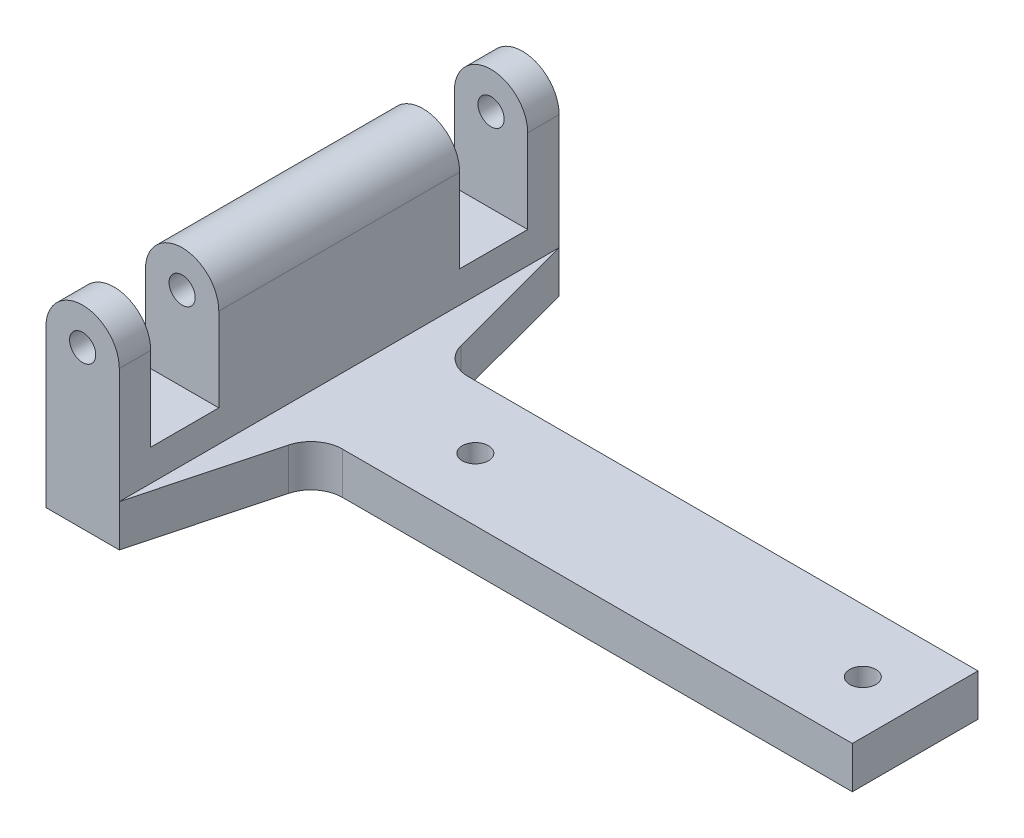
ISO-10303-21;
HEADER;
FILE_DESCRIPTION(('STEP AP214'),'2;1');
FILE_NAME('part.step','',(''),(''),'','','');
FILE_SCHEMA(('AUTOMOTIVE_DESIGN { 1 0 10303 214 1 1 1 1 }'));
ENDSEC;
DATA;
#1=APPLICATION_CONTEXT('core data for automotive mechanical design processes');
#2=APPLICATION_PROTOCOL_DEFINITION('international standard','automotive_design',2000,#1);
#3=PRODUCT_CONTEXT('',#1,'mechanical');
#4=PRODUCT('Part','Part','',(#3));
#5=PRODUCT_RELATED_PRODUCT_CATEGORY('part','',(#4));
#6=PRODUCT_DEFINITION_FORMATION('','',#4);
#7=PRODUCT_DEFINITION_CONTEXT('part definition',#1,'design');
#8=PRODUCT_DEFINITION('design','',#6,#7);
#9=PRODUCT_DEFINITION_SHAPE('','',#8);
#10=(LENGTH_UNIT() NAMED_UNIT(*) SI_UNIT(.MILLI.,.METRE.));
#11=(NAMED_UNIT(*) PLANE_ANGLE_UNIT() SI_UNIT($,.RADIAN.));
#12=(NAMED_UNIT(*) SI_UNIT($,.STERADIAN.) SOLID_ANGLE_UNIT());
#13=UNCERTAINTY_MEASURE_WITH_UNIT(LENGTH_MEASURE(1.E-05),#10,'distance_accuracy_value','');
#14=(GEOMETRIC_REPRESENTATION_CONTEXT(3) GLOBAL_UNCERTAINTY_ASSIGNED_CONTEXT((#13)) GLOBAL_UNIT_ASSIGNED_CONTEXT((#10,
#11,#12)) REPRESENTATION_CONTEXT('',''));
#15=CARTESIAN_POINT('',(0.,0.,0.));
#16=DIRECTION('',(0.,0.,1.));
#17=DIRECTION('',(1.,0.,0.));
#18=AXIS2_PLACEMENT_3D('',#15,#16,#17);
#19=CARTESIAN_POINT('',(-31.,15.,21.));
#20=DIRECTION('',(0.,0.,1.));
#21=DIRECTION('',(1.,0.,0.));
#22=AXIS2_PLACEMENT_3D('',#19,#20,#21);
#23=CYLINDRICAL_SURFACE('',#22,1.24999999999999);
#24=CARTESIAN_POINT('',(-31.,15.,-11.5));
#25=DIRECTION('',(0.,0.,1.));
#26=DIRECTION('',(1.,0.,0.));
#27=AXIS2_PLACEMENT_3D('',#24,#25,#26);
#28=CIRCLE('',#27,1.24999999999999);
#29=CARTESIAN_POINT('',(-29.75,15.,-11.5));
#30=VERTEX_POINT('',#29);
#31=EDGE_CURVE('E246',#30,#30,#28,.F.);
#32=ORIENTED_EDGE('',*,*,#31,.T.);
#33=EDGE_LOOP('',(#32));
#34=FACE_BOUND('',#33,.T.);
#35=CARTESIAN_POINT('',(-31.,15.,11.5));
#36=DIRECTION('',(0.,0.,1.));
#37=DIRECTION('',(1.,0.,0.));
#38=AXIS2_PLACEMENT_3D('',#35,#36,#37);
#39=CIRCLE('',#38,1.24999999999999);
#40=CARTESIAN_POINT('',(-29.75,15.,11.5));
#41=VERTEX_POINT('',#40);
#42=EDGE_CURVE('E144',#41,#41,#39,.T.);
#43=ORIENTED_EDGE('',*,*,#42,.T.);
#44=EDGE_LOOP('',(#43));
#45=FACE_BOUND('',#44,.T.);
#46=ADVANCED_FACE('F17',(#34,#45),#23,.F.);
#47=CARTESIAN_POINT('',(-31.,15.,21.));
#48=DIRECTION('',(0.,0.,1.));
#49=DIRECTION('',(1.,0.,0.));
#50=AXIS2_PLACEMENT_3D('',#47,#48,#49);
#51=CYLINDRICAL_SURFACE('',#50,1.24999999999999);
#52=CARTESIAN_POINT('',(-31.,15.,-21.));
#53=DIRECTION('',(0.,0.,1.));
#54=DIRECTION('',(1.,0.,0.));
#55=AXIS2_PLACEMENT_3D('',#52,#53,#54);
#56=CIRCLE('',#55,1.24999999999999);
#57=CARTESIAN_POINT('',(-29.75,15.,-21.));
#58=VERTEX_POINT('',#57);
#59=EDGE_CURVE('E222',#58,#58,#56,.F.);
#60=ORIENTED_EDGE('',*,*,#59,.T.);
#61=EDGE_LOOP('',(#60));
#62=FACE_BOUND('',#61,.T.);
#63=CARTESIAN_POINT('',(-31.,15.,-18.));
#64=DIRECTION('',(0.,0.,1.));
#65=DIRECTION('',(1.,0.,0.));
#66=AXIS2_PLACEMENT_3D('',#63,#64,#65);
#67=CIRCLE('',#66,1.24999999999999);
#68=CARTESIAN_POINT('',(-29.75,15.,-18.));
#69=VERTEX_POINT('',#68);
#70=EDGE_CURVE('E20',#69,#69,#67,.T.);
#71=ORIENTED_EDGE('',*,*,#70,.T.);
#72=EDGE_LOOP('',(#71));
#73=FACE_BOUND('',#72,.T.);
#74=ADVANCED_FACE('F261',(#62,#73),#51,.F.);
#75=CARTESIAN_POINT('',(-34.5,30.5709247622408,-18.));
#76=DIRECTION('',(0.,0.,-1.));
#77=DIRECTION('',(0.,1.,0.));
#78=AXIS2_PLACEMENT_3D('',#75,#76,#77);
#79=PLANE('',#78);
#80=DIRECTION('',(0.,1.,0.));
#81=VECTOR('',#80,1.);
#82=CARTESIAN_POINT('',(-34.5,0.,-18.));
#83=LINE('',#82,#81);
#84=CARTESIAN_POINT('',(-34.5,6.99999999999999,-18.));
#85=VERTEX_POINT('',#84);
#86=CARTESIAN_POINT('',(-34.5,15.,-18.));
#87=VERTEX_POINT('',#86);
#88=EDGE_CURVE('E107',#85,#87,#83,.T.);
#89=ORIENTED_EDGE('',*,*,#88,.F.);
#90=DIRECTION('',(1.,0.,0.));
#91=VECTOR('',#90,1.);
#92=CARTESIAN_POINT('',(-34.5,6.99999999999999,-18.));
#93=LINE('',#92,#91);
#94=CARTESIAN_POINT('',(-27.5,6.99999999999999,-18.));
#95=VERTEX_POINT('',#94);
#96=EDGE_CURVE('E115',#85,#95,#93,.T.);
#97=ORIENTED_EDGE('',*,*,#96,.T.);
#98=DIRECTION('',(0.,1.,0.));
#99=VECTOR('',#98,1.);
#100=CARTESIAN_POINT('',(-27.5,0.,-18.));
#101=LINE('',#100,#99);
#102=CARTESIAN_POINT('',(-27.5,15.,-18.));
#103=VERTEX_POINT('',#102);
#104=EDGE_CURVE('E186',#103,#95,#101,.F.);
#105=ORIENTED_EDGE('',*,*,#104,.F.);
#106=CARTESIAN_POINT('',(-31.,15.,-18.));
#107=DIRECTION('',(0.,0.,1.));
#108=DIRECTION('',(1.,0.,0.));
#109=AXIS2_PLACEMENT_3D('',#106,#107,#108);
#110=CIRCLE('',#109,3.5);
#111=EDGE_CURVE('E145',#87,#103,#110,.F.);
#112=ORIENTED_EDGE('',*,*,#111,.F.);
#113=EDGE_LOOP('',(#89,#97,#105,#112));
#114=FACE_BOUND('',#113,.T.);
#115=ORIENTED_EDGE('',*,*,#70,.F.);
#116=EDGE_LOOP('',(#115));
#117=FACE_BOUND('',#116,.T.);
#118=ADVANCED_FACE('F263',(#114,#117),#79,.F.);
#119=CARTESIAN_POINT('',(-31.,15.,-40.7800404448525));
#120=DIRECTION('',(0.,0.,1.));
#121=DIRECTION('',(1.,0.,0.));
#122=AXIS2_PLACEMENT_3D('',#119,#120,#121);
#123=CYLINDRICAL_SURFACE('',#122,3.5);
#124=CARTESIAN_POINT('',(-31.,15.,-21.));
#125=DIRECTION('',(0.,0.,1.));
#126=DIRECTION('',(1.,0.,0.));
#127=AXIS2_PLACEMENT_3D('',#124,#125,#126);
#128=CIRCLE('',#127,3.5);
#129=CARTESIAN_POINT('',(-27.5,15.,-21.));
#130=VERTEX_POINT('',#129);
#131=CARTESIAN_POINT('',(-34.5,15.,-21.));
#132=VERTEX_POINT('',#131);
#133=EDGE_CURVE('E218',#130,#132,#128,.T.);
#134=ORIENTED_EDGE('',*,*,#133,.T.);
#135=DIRECTION('',(0.,0.,1.));
#136=VECTOR('',#135,1.);
#137=CARTESIAN_POINT('',(-34.5,15.,-40.7800404448525));
#138=LINE('',#137,#136);
#139=EDGE_CURVE('E608',#87,#132,#138,.F.);
#140=ORIENTED_EDGE('',*,*,#139,.F.);
#141=ORIENTED_EDGE('',*,*,#111,.T.);
#142=DIRECTION('',(0.,0.,1.));
#143=VECTOR('',#142,1.);
#144=CARTESIAN_POINT('',(-27.5,15.,-40.7800404448525));
#145=LINE('',#144,#143);
#146=EDGE_CURVE('E163',#130,#103,#145,.T.);
#147=ORIENTED_EDGE('',*,*,#146,.F.);
#148=EDGE_LOOP('',(#134,#140,#141,#147));
#149=FACE_BOUND('',#148,.T.);
#150=ADVANCED_FACE('F265',(#149),#123,.T.);
#151=CARTESIAN_POINT('',(-34.5,31.9586405510147,18.));
#152=DIRECTION('',(0.,0.,1.));
#153=DIRECTION('',(0.,-1.,0.));
#154=AXIS2_PLACEMENT_3D('',#151,#152,#153);
#155=PLANE('',#154);
#156=DIRECTION('',(0.,1.,0.));
#157=VECTOR('',#156,1.);
#158=CARTESIAN_POINT('',(-27.5,0.,18.));
#159=LINE('',#158,#157);
#160=CARTESIAN_POINT('',(-27.5,6.99999999999999,18.));
#161=VERTEX_POINT('',#160);
#162=CARTESIAN_POINT('',(-27.5,15.,18.));
#163=VERTEX_POINT('',#162);
#164=EDGE_CURVE('E151',#161,#163,#159,.T.);
#165=ORIENTED_EDGE('',*,*,#164,.F.);
#166=DIRECTION('',(1.,0.,0.));
#167=VECTOR('',#166,1.);
#168=CARTESIAN_POINT('',(-34.5,6.99999999999999,18.));
#169=LINE('',#168,#167);
#170=CARTESIAN_POINT('',(-34.5,6.99999999999999,18.));
#171=VERTEX_POINT('',#170);
#172=EDGE_CURVE('E135',#161,#171,#169,.F.);
#173=ORIENTED_EDGE('',*,*,#172,.T.);
#174=DIRECTION('',(0.,1.,0.));
#175=VECTOR('',#174,1.);
#176=CARTESIAN_POINT('',(-34.5,0.,18.));
#177=LINE('',#176,#175);
#178=CARTESIAN_POINT('',(-34.5,15.,18.));
#179=VERTEX_POINT('',#178);
#180=EDGE_CURVE('E589',#179,#171,#177,.F.);
#181=ORIENTED_EDGE('',*,*,#180,.F.);
#182=CARTESIAN_POINT('',(-31.,15.,18.));
#183=DIRECTION('',(0.,0.,1.));
#184=DIRECTION('',(1.,0.,0.));
#185=AXIS2_PLACEMENT_3D('',#182,#183,#184);
#186=CIRCLE('',#185,3.5);
#187=EDGE_CURVE('E159',#163,#179,#186,.T.);
#188=ORIENTED_EDGE('',*,*,#187,.F.);
#189=EDGE_LOOP('',(#165,#173,#181,#188));
#190=FACE_BOUND('',#189,.T.);
#191=CARTESIAN_POINT('',(-31.,15.,18.));
#192=DIRECTION('',(0.,0.,1.));
#193=DIRECTION('',(1.,0.,0.));
#194=AXIS2_PLACEMENT_3D('',#191,#192,#193);
#195=CIRCLE('',#194,1.24999999999999);
#196=CARTESIAN_POINT('',(-29.75,15.,18.));
#197=VERTEX_POINT('',#196);
#198=EDGE_CURVE('E238',#197,#197,#195,.T.);
#199=ORIENTED_EDGE('',*,*,#198,.T.);
#200=EDGE_LOOP('',(#199));
#201=FACE_BOUND('',#200,.T.);
#202=ADVANCED_FACE('F157',(#190,#201),#155,.F.);
#203=CARTESIAN_POINT('',(-34.5,6.99999999999999,18.));
#204=DIRECTION('',(0.,-1.,0.));
#205=DIRECTION('',(0.,0.,-1.));
#206=AXIS2_PLACEMENT_3D('',#203,#204,#205);
#207=PLANE('',#206);
#208=DIRECTION('',(1.,0.,0.));
#209=VECTOR('',#208,1.);
#210=CARTESIAN_POINT('',(-34.5,6.99999999999999,11.5));
#211=LINE('',#210,#209);
#212=CARTESIAN_POINT('',(-27.5,6.99999999999999,11.5));
#213=VERTEX_POINT('',#212);
#214=CARTESIAN_POINT('',(-34.5,6.99999999999999,11.5));
#215=VERTEX_POINT('',#214);
#216=EDGE_CURVE('E251',#213,#215,#211,.F.);
#217=ORIENTED_EDGE('',*,*,#216,.T.);
#218=DIRECTION('',(0.,0.,1.));
#219=VECTOR('',#218,1.);
#220=CARTESIAN_POINT('',(-34.5,6.99999999999999,-40.7800404448525));
#221=LINE('',#220,#219);
#222=EDGE_CURVE('E140',#171,#215,#221,.F.);
#223=ORIENTED_EDGE('',*,*,#222,.F.);
#224=ORIENTED_EDGE('',*,*,#172,.F.);
#225=DIRECTION('',(0.,0.,1.));
#226=VECTOR('',#225,1.);
#227=CARTESIAN_POINT('',(-27.5,6.99999999999999,-40.7800404448525));
#228=LINE('',#227,#226);
#229=EDGE_CURVE('E139',#213,#161,#228,.T.);
#230=ORIENTED_EDGE('',*,*,#229,.F.);
#231=EDGE_LOOP('',(#217,#223,#224,#230));
#232=FACE_BOUND('',#231,.T.);
#233=ADVANCED_FACE('F138',(#232),#207,.F.);
#234=CARTESIAN_POINT('',(-34.5,31.9586405510147,11.5));
#235=DIRECTION('',(0.,0.,-1.));
#236=DIRECTION('',(0.,1.,0.));
#237=AXIS2_PLACEMENT_3D('',#234,#235,#236);
#238=PLANE('',#237);
#239=DIRECTION('',(0.,1.,0.));
#240=VECTOR('',#239,1.);
#241=CARTESIAN_POINT('',(-34.5,0.,11.5));
#242=LINE('',#241,#240);
#243=CARTESIAN_POINT('',(-34.5,15.,11.5));
#244=VERTEX_POINT('',#243);
#245=EDGE_CURVE('E583',#215,#244,#242,.T.);
#246=ORIENTED_EDGE('',*,*,#245,.F.);
#247=ORIENTED_EDGE('',*,*,#216,.F.);
#248=DIRECTION('',(0.,1.,0.));
#249=VECTOR('',#248,1.);
#250=CARTESIAN_POINT('',(-27.5,0.,11.5));
#251=LINE('',#250,#249);
#252=CARTESIAN_POINT('',(-27.5,15.,11.5));
#253=VERTEX_POINT('',#252);
#254=EDGE_CURVE('E155',#253,#213,#251,.F.);
#255=ORIENTED_EDGE('',*,*,#254,.F.);
#256=CARTESIAN_POINT('',(-31.,15.,11.5));
#257=DIRECTION('',(0.,0.,1.));
#258=DIRECTION('',(1.,0.,0.));
#259=AXIS2_PLACEMENT_3D('',#256,#257,#258);
#260=CIRCLE('',#259,3.5);
#261=EDGE_CURVE('E249',#244,#253,#260,.F.);
#262=ORIENTED_EDGE('',*,*,#261,.F.);
#263=EDGE_LOOP('',(#246,#247,#255,#262));
#264=FACE_BOUND('',#263,.T.);
#265=ORIENTED_EDGE('',*,*,#42,.F.);
#266=EDGE_LOOP('',(#265));
#267=FACE_BOUND('',#266,.T.);
#268=ADVANCED_FACE('F354',(#264,#267),#238,.F.);
#269=CARTESIAN_POINT('',(-31.,15.,-40.7800404448525));
#270=DIRECTION('',(0.,0.,1.));
#271=DIRECTION('',(1.,0.,0.));
#272=AXIS2_PLACEMENT_3D('',#269,#270,#271);
#273=CYLINDRICAL_SURFACE('',#272,3.5);
#274=ORIENTED_EDGE('',*,*,#261,.T.);
#275=DIRECTION('',(0.,0.,1.));
#276=VECTOR('',#275,1.);
#277=CARTESIAN_POINT('',(-27.5,15.,-40.7800404448525));
#278=LINE('',#277,#276);
#279=CARTESIAN_POINT('',(-27.5,15.,-11.5));
#280=VERTEX_POINT('',#279);
#281=EDGE_CURVE('E174',#280,#253,#278,.T.);
#282=ORIENTED_EDGE('',*,*,#281,.F.);
#283=CARTESIAN_POINT('',(-31.,15.,-11.5));
#284=DIRECTION('',(0.,0.,1.));
#285=DIRECTION('',(1.,0.,0.));
#286=AXIS2_PLACEMENT_3D('',#283,#284,#285);
#287=CIRCLE('',#286,3.5);
#288=CARTESIAN_POINT('',(-34.5,15.,-11.5));
#289=VERTEX_POINT('',#288);
#290=EDGE_CURVE('E242',#280,#289,#287,.T.);
#291=ORIENTED_EDGE('',*,*,#290,.T.);
#292=DIRECTION('',(0.,0.,1.));
#293=VECTOR('',#292,1.);
#294=CARTESIAN_POINT('',(-34.5,15.,-40.7800404448525));
#295=LINE('',#294,#293);
#296=EDGE_CURVE('E585',#244,#289,#295,.F.);
#297=ORIENTED_EDGE('',*,*,#296,.F.);
#298=EDGE_LOOP('',(#274,#282,#291,#297));
#299=FACE_BOUND('',#298,.T.);
#300=ADVANCED_FACE('F350',(#299),#273,.T.);
#301=CARTESIAN_POINT('',(-34.5,30.5709247622408,-11.5));
#302=DIRECTION('',(0.,0.,1.));
#303=DIRECTION('',(0.,-1.,0.));
#304=AXIS2_PLACEMENT_3D('',#301,#302,#303);
#305=PLANE('',#304);
#306=DIRECTION('',(0.,1.,0.));
#307=VECTOR('',#306,1.);
#308=CARTESIAN_POINT('',(-27.5,0.,-11.5));
#309=LINE('',#308,#307);
#310=CARTESIAN_POINT('',(-27.5,6.99999999999999,-11.5));
#311=VERTEX_POINT('',#310);
#312=EDGE_CURVE('E178',#311,#280,#309,.T.);
#313=ORIENTED_EDGE('',*,*,#312,.F.);
#314=DIRECTION('',(1.,0.,0.));
#315=VECTOR('',#314,1.);
#316=CARTESIAN_POINT('',(-34.5,6.99999999999999,-11.5));
#317=LINE('',#316,#315);
#318=CARTESIAN_POINT('',(-34.5,6.99999999999999,-11.5));
#319=VERTEX_POINT('',#318);
#320=EDGE_CURVE('E245',#311,#319,#317,.F.);
#321=ORIENTED_EDGE('',*,*,#320,.T.);
#322=DIRECTION('',(0.,1.,0.));
#323=VECTOR('',#322,1.);
#324=CARTESIAN_POINT('',(-34.5,0.,-11.5));
#325=LINE('',#324,#323);
#326=EDGE_CURVE('E587',#289,#319,#325,.F.);
#327=ORIENTED_EDGE('',*,*,#326,.F.);
#328=ORIENTED_EDGE('',*,*,#290,.F.);
#329=EDGE_LOOP('',(#313,#321,#327,#328));
#330=FACE_BOUND('',#329,.T.);
#331=ORIENTED_EDGE('',*,*,#31,.F.);
#332=EDGE_LOOP('',(#331));
#333=FACE_BOUND('',#332,.T.);
#334=ADVANCED_FACE('F347',(#330,#333),#305,.F.);
#335=CARTESIAN_POINT('',(-34.5,6.99999999999999,-11.5));
#336=DIRECTION('',(0.,-1.,0.));
#337=DIRECTION('',(0.,0.,-1.));
#338=AXIS2_PLACEMENT_3D('',#335,#336,#337);
#339=PLANE('',#338);
#340=ORIENTED_EDGE('',*,*,#96,.F.);
#341=DIRECTION('',(0.,0.,1.));
#342=VECTOR('',#341,1.);
#343=CARTESIAN_POINT('',(-34.5,6.99999999999999,-40.7800404448525));
#344=LINE('',#343,#342);
#345=EDGE_CURVE('E631',#319,#85,#344,.F.);
#346=ORIENTED_EDGE('',*,*,#345,.F.);
#347=ORIENTED_EDGE('',*,*,#320,.F.);
#348=DIRECTION('',(0.,0.,1.));
#349=VECTOR('',#348,1.);
#350=CARTESIAN_POINT('',(-27.5,6.99999999999999,-40.7800404448525));
#351=LINE('',#350,#349);
#352=EDGE_CURVE('E181',#95,#311,#351,.T.);
#353=ORIENTED_EDGE('',*,*,#352,.F.);
#354=EDGE_LOOP('',(#340,#346,#347,#353));
#355=FACE_BOUND('',#354,.T.);
#356=ADVANCED_FACE('F343',(#355),#339,.F.);
#357=CARTESIAN_POINT('',(-31.,15.,-40.7800404448525));
#358=DIRECTION('',(0.,0.,1.));
#359=DIRECTION('',(1.,0.,0.));
#360=AXIS2_PLACEMENT_3D('',#357,#358,#359);
#361=CYLINDRICAL_SURFACE('',#360,3.5);
#362=CARTESIAN_POINT('',(-31.,15.,21.));
#363=DIRECTION('',(0.,0.,1.));
#364=DIRECTION('',(1.,0.,0.));
#365=AXIS2_PLACEMENT_3D('',#362,#363,#364);
#366=CIRCLE('',#365,3.5);
#367=CARTESIAN_POINT('',(-34.5,15.,21.));
#368=VERTEX_POINT('',#367);
#369=CARTESIAN_POINT('',(-27.5,15.,21.));
#370=VERTEX_POINT('',#369);
#371=EDGE_CURVE('E214',#368,#370,#366,.F.);
#372=ORIENTED_EDGE('',*,*,#371,.T.);
#373=DIRECTION('',(0.,0.,1.));
#374=VECTOR('',#373,1.);
#375=CARTESIAN_POINT('',(-27.5,15.,-40.7800404448525));
#376=LINE('',#375,#374);
#377=EDGE_CURVE('E161',#163,#370,#376,.T.);
#378=ORIENTED_EDGE('',*,*,#377,.F.);
#379=ORIENTED_EDGE('',*,*,#187,.T.);
#380=DIRECTION('',(0.,0.,1.));
#381=VECTOR('',#380,1.);
#382=CARTESIAN_POINT('',(-34.5,15.,-40.7800404448525));
#383=LINE('',#382,#381);
#384=EDGE_CURVE('E605',#368,#179,#383,.F.);
#385=ORIENTED_EDGE('',*,*,#384,.F.);
#386=EDGE_LOOP('',(#372,#378,#379,#385));
#387=FACE_BOUND('',#386,.T.);
#388=ADVANCED_FACE('F340',(#387),#361,.T.);
#389=CARTESIAN_POINT('',(-27.5,0.,-40.7800404448525));
#390=DIRECTION('',(1.,0.,0.));
#391=DIRECTION('',(0.,1.,0.));
#392=AXIS2_PLACEMENT_3D('',#389,#390,#391);
#393=PLANE('',#392);
#394=DIRECTION('',(0.,1.,0.));
#395=VECTOR('',#394,1.);
#396=CARTESIAN_POINT('',(-27.5,4.,-21.));
#397=LINE('',#396,#395);
#398=CARTESIAN_POINT('',(-27.5,4.,-21.));
#399=VERTEX_POINT('',#398);
#400=EDGE_CURVE('E612',#399,#130,#397,.T.);
#401=ORIENTED_EDGE('',*,*,#400,.T.);
#402=ORIENTED_EDGE('',*,*,#146,.T.);
#403=ORIENTED_EDGE('',*,*,#104,.T.);
#404=ORIENTED_EDGE('',*,*,#352,.T.);
#405=ORIENTED_EDGE('',*,*,#312,.T.);
#406=ORIENTED_EDGE('',*,*,#281,.T.);
#407=ORIENTED_EDGE('',*,*,#254,.T.);
#408=ORIENTED_EDGE('',*,*,#229,.T.);
#409=ORIENTED_EDGE('',*,*,#164,.T.);
#410=ORIENTED_EDGE('',*,*,#377,.T.);
#411=DIRECTION('',(0.,1.,0.));
#412=VECTOR('',#411,1.);
#413=CARTESIAN_POINT('',(-27.5,4.,21.));
#414=LINE('',#413,#412);
#415=CARTESIAN_POINT('',(-27.5,4.,21.));
#416=VERTEX_POINT('',#415);
#417=EDGE_CURVE('E213',#370,#416,#414,.F.);
#418=ORIENTED_EDGE('',*,*,#417,.T.);
#419=DIRECTION('',(0.,0.,1.));
#420=VECTOR('',#419,1.);
#421=CARTESIAN_POINT('',(-27.5,4.,0.));
#422=LINE('',#421,#420);
#423=EDGE_CURVE('E237',#399,#416,#422,.T.);
#424=ORIENTED_EDGE('',*,*,#423,.F.);
#425=EDGE_LOOP('',(#401,#402,#403,#404,#405,#406,#407,#408,#409,#410,#418,#424));
#426=FACE_BOUND('',#425,.T.);
#427=ADVANCED_FACE('F150',(#426),#393,.T.);
#428=CARTESIAN_POINT('',(-31.,15.,21.));
#429=DIRECTION('',(0.,0.,1.));
#430=DIRECTION('',(1.,0.,0.));
#431=AXIS2_PLACEMENT_3D('',#428,#429,#430);
#432=CYLINDRICAL_SURFACE('',#431,1.24999999999999);
#433=ORIENTED_EDGE('',*,*,#198,.F.);
#434=EDGE_LOOP('',(#433));
#435=FACE_BOUND('',#434,.T.);
#436=CARTESIAN_POINT('',(-31.,15.,21.));
#437=DIRECTION('',(0.,0.,1.));
#438=DIRECTION('',(1.,0.,0.));
#439=AXIS2_PLACEMENT_3D('',#436,#437,#438);
#440=CIRCLE('',#439,1.24999999999999);
#441=CARTESIAN_POINT('',(-29.75,15.,21.));
#442=VERTEX_POINT('',#441);
#443=EDGE_CURVE('E209',#442,#442,#440,.T.);
#444=ORIENTED_EDGE('',*,*,#443,.T.);
#445=EDGE_LOOP('',(#444));
#446=FACE_BOUND('',#445,.T.);
#447=ADVANCED_FACE('F333',(#435,#446),#432,.F.);
#448=CARTESIAN_POINT('',(0.,4.,0.));
#449=DIRECTION('',(0.,1.,0.));
#450=DIRECTION('',(0.,0.,1.));
#451=AXIS2_PLACEMENT_3D('',#448,#449,#450);
#452=PLANE('',#451);
#453=CARTESIAN_POINT('',(22.5,4.,0.));
#454=DIRECTION('',(0.,1.,0.));
#455=DIRECTION('',(0.,0.,1.));
#456=AXIS2_PLACEMENT_3D('',#453,#454,#455);
#457=CIRCLE('',#456,1.24999999999999);
#458=CARTESIAN_POINT('',(22.5,4.,1.24999999999999));
#459=VERTEX_POINT('',#458);
#460=EDGE_CURVE('E230',#459,#459,#457,.F.);
#461=ORIENTED_EDGE('',*,*,#460,.T.);
#462=EDGE_LOOP('',(#461));
#463=FACE_BOUND('',#462,.T.);
#464=CARTESIAN_POINT('',(-14.5,4.,0.));
#465=DIRECTION('',(0.,1.,0.));
#466=DIRECTION('',(0.,0.,1.));
#467=AXIS2_PLACEMENT_3D('',#464,#465,#466);
#468=CIRCLE('',#467,1.24999999999999);
#469=CARTESIAN_POINT('',(-14.5,4.,1.24999999999999));
#470=VERTEX_POINT('',#469);
#471=EDGE_CURVE('E234',#470,#470,#468,.F.);
#472=ORIENTED_EDGE('',*,*,#471,.T.);
#473=EDGE_LOOP('',(#472));
#474=FACE_BOUND('',#473,.T.);
#475=DIRECTION('',(0.257662650560333,0.,0.966234939601246));
#476=VECTOR('',#475,1.);
#477=CARTESIAN_POINT('',(-27.5,4.,-21.));
#478=LINE('',#477,#476);
#479=CARTESIAN_POINT('',(-24.0938698795517,4.,-8.227012048319));
#480=VERTEX_POINT('',#479);
#481=EDGE_CURVE('E225',#480,#399,#478,.F.);
#482=ORIENTED_EDGE('',*,*,#481,.T.);
#483=ORIENTED_EDGE('',*,*,#423,.T.);
#484=DIRECTION('',(-0.257662650560333,0.,0.966234939601246));
#485=VECTOR('',#484,1.);
#486=CARTESIAN_POINT('',(-23.5,4.,6.00000000000001));
#487=LINE('',#486,#485);
#488=CARTESIAN_POINT('',(-24.0938698795517,4.,8.22701204831901));
#489=VERTEX_POINT('',#488);
#490=EDGE_CURVE('E650',#416,#489,#487,.F.);
#491=ORIENTED_EDGE('',*,*,#490,.T.);
#492=CARTESIAN_POINT('',(-21.195165060748,4.,9.00000000000001));
#493=DIRECTION('',(0.,-1.,0.));
#494=DIRECTION('',(0.,0.,-1.));
#495=AXIS2_PLACEMENT_3D('',#492,#493,#494);
#496=CIRCLE('',#495,3.);
#497=CARTESIAN_POINT('',(-21.195165060748,4.,6.00000000000001));
#498=VERTEX_POINT('',#497);
#499=EDGE_CURVE('E205',#489,#498,#496,.T.);
#500=ORIENTED_EDGE('',*,*,#499,.T.);
#501=DIRECTION('',(-1.,0.,0.));
#502=VECTOR('',#501,1.);
#503=CARTESIAN_POINT('',(27.5,4.,6.));
#504=LINE('',#503,#502);
#505=CARTESIAN_POINT('',(27.5,4.,6.));
#506=VERTEX_POINT('',#505);
#507=EDGE_CURVE('E204',#498,#506,#504,.F.);
#508=ORIENTED_EDGE('',*,*,#507,.T.);
#509=DIRECTION('',(0.,0.,1.));
#510=VECTOR('',#509,1.);
#511=CARTESIAN_POINT('',(27.5,4.,-21.));
#512=LINE('',#511,#510);
#513=CARTESIAN_POINT('',(27.5,4.,-6.));
#514=VERTEX_POINT('',#513);
#515=EDGE_CURVE('E233',#506,#514,#512,.F.);
#516=ORIENTED_EDGE('',*,*,#515,.T.);
#517=DIRECTION('',(1.,0.,0.));
#518=VECTOR('',#517,1.);
#519=CARTESIAN_POINT('',(27.5,4.,-6.));
#520=LINE('',#519,#518);
#521=CARTESIAN_POINT('',(-21.195165060748,4.,-6.));
#522=VERTEX_POINT('',#521);
#523=EDGE_CURVE('E623',#514,#522,#520,.F.);
#524=ORIENTED_EDGE('',*,*,#523,.T.);
#525=CARTESIAN_POINT('',(-21.195165060748,4.,-9.));
#526=DIRECTION('',(0.,-1.,0.));
#527=DIRECTION('',(0.,0.,-1.));
#528=AXIS2_PLACEMENT_3D('',#525,#526,#527);
#529=CIRCLE('',#528,3.);
#530=EDGE_CURVE('E226',#522,#480,#529,.T.);
#531=ORIENTED_EDGE('',*,*,#530,.T.);
#532=EDGE_LOOP('',(#482,#483,#491,#500,#508,#516,#524,#531));
#533=FACE_BOUND('',#532,.T.);
#534=ADVANCED_FACE('F329',(#463,#474,#533),#452,.T.);
#535=CARTESIAN_POINT('',(-14.5,4.,0.));
#536=DIRECTION('',(0.,1.,0.));
#537=DIRECTION('',(0.,0.,1.));
#538=AXIS2_PLACEMENT_3D('',#535,#536,#537);
#539=CYLINDRICAL_SURFACE('',#538,1.24999999999999);
#540=CARTESIAN_POINT('',(-14.5,0.,0.));
#541=DIRECTION('',(0.,1.,0.));
#542=DIRECTION('',(0.,0.,1.));
#543=AXIS2_PLACEMENT_3D('',#540,#541,#542);
#544=CIRCLE('',#543,1.24999999999999);
#545=CARTESIAN_POINT('',(-14.5,0.,1.24999999999999));
#546=VERTEX_POINT('',#545);
#547=EDGE_CURVE('E201',#546,#546,#544,.F.);
#548=ORIENTED_EDGE('',*,*,#547,.T.);
#549=EDGE_LOOP('',(#548));
#550=FACE_BOUND('',#549,.T.);
#551=ORIENTED_EDGE('',*,*,#471,.F.);
#552=EDGE_LOOP('',(#551));
#553=FACE_BOUND('',#552,.T.);
#554=ADVANCED_FACE('F325',(#550,#553),#539,.F.);
#555=CARTESIAN_POINT('',(22.5,4.,0.));
#556=DIRECTION('',(0.,1.,0.));
#557=DIRECTION('',(0.,0.,1.));
#558=AXIS2_PLACEMENT_3D('',#555,#556,#557);
#559=CYLINDRICAL_SURFACE('',#558,1.24999999999999);
#560=CARTESIAN_POINT('',(22.5,0.,0.));
#561=DIRECTION('',(0.,1.,0.));
#562=DIRECTION('',(0.,0.,1.));
#563=AXIS2_PLACEMENT_3D('',#560,#561,#562);
#564=CIRCLE('',#563,1.24999999999999);
#565=CARTESIAN_POINT('',(22.5,0.,1.24999999999999));
#566=VERTEX_POINT('',#565);
#567=EDGE_CURVE('E197',#566,#566,#564,.F.);
#568=ORIENTED_EDGE('',*,*,#567,.T.);
#569=EDGE_LOOP('',(#568));
#570=FACE_BOUND('',#569,.T.);
#571=ORIENTED_EDGE('',*,*,#460,.F.);
#572=EDGE_LOOP('',(#571));
#573=FACE_BOUND('',#572,.T.);
#574=ADVANCED_FACE('F321',(#570,#573),#559,.F.);
#575=CARTESIAN_POINT('',(27.5,4.,-21.));
#576=DIRECTION('',(-1.,0.,0.));
#577=DIRECTION('',(0.,0.,1.));
#578=AXIS2_PLACEMENT_3D('',#575,#576,#577);
#579=PLANE('',#578);
#580=DIRECTION('',(0.,1.,0.));
#581=VECTOR('',#580,1.);
#582=CARTESIAN_POINT('',(27.5,0.,6.));
#583=LINE('',#582,#581);
#584=CARTESIAN_POINT('',(27.5,0.,6.00000000000001));
#585=VERTEX_POINT('',#584);
#586=EDGE_CURVE('E207',#506,#585,#583,.F.);
#587=ORIENTED_EDGE('',*,*,#586,.T.);
#588=DIRECTION('',(0.,0.,1.));
#589=VECTOR('',#588,1.);
#590=CARTESIAN_POINT('',(27.5,0.,0.));
#591=LINE('',#590,#589);
#592=CARTESIAN_POINT('',(27.5,0.,-6.));
#593=VERTEX_POINT('',#592);
#594=EDGE_CURVE('E200',#585,#593,#591,.F.);
#595=ORIENTED_EDGE('',*,*,#594,.T.);
#596=DIRECTION('',(0.,1.,0.));
#597=VECTOR('',#596,1.);
#598=CARTESIAN_POINT('',(27.5,0.,-6.));
#599=LINE('',#598,#597);
#600=EDGE_CURVE('E625',#593,#514,#599,.T.);
#601=ORIENTED_EDGE('',*,*,#600,.T.);
#602=ORIENTED_EDGE('',*,*,#515,.F.);
#603=EDGE_LOOP('',(#587,#595,#601,#602));
#604=FACE_BOUND('',#603,.T.);
#605=ADVANCED_FACE('F317',(#604),#579,.F.);
#606=CARTESIAN_POINT('',(27.5,0.,-6.));
#607=DIRECTION('',(0.,0.,1.));
#608=DIRECTION('',(1.,0.,0.));
#609=AXIS2_PLACEMENT_3D('',#606,#607,#608);
#610=PLANE('',#609);
#611=DIRECTION('',(0.,-1.,0.));
#612=VECTOR('',#611,1.);
#613=CARTESIAN_POINT('',(-21.195165060748,0.,-5.99999999999999));
#614=LINE('',#613,#612);
#615=CARTESIAN_POINT('',(-21.195165060748,0.,-6.));
#616=VERTEX_POINT('',#615);
#617=EDGE_CURVE('E229',#616,#522,#614,.F.);
#618=ORIENTED_EDGE('',*,*,#617,.T.);
#619=ORIENTED_EDGE('',*,*,#523,.F.);
#620=ORIENTED_EDGE('',*,*,#600,.F.);
#621=DIRECTION('',(1.,0.,0.));
#622=VECTOR('',#621,1.);
#623=CARTESIAN_POINT('',(0.,0.,-6.));
#624=LINE('',#623,#622);
#625=EDGE_CURVE('E196',#593,#616,#624,.F.);
#626=ORIENTED_EDGE('',*,*,#625,.T.);
#627=EDGE_LOOP('',(#618,#619,#620,#626));
#628=FACE_BOUND('',#627,.T.);
#629=ADVANCED_FACE('F313',(#628),#610,.F.);
#630=CARTESIAN_POINT('',(-21.195165060748,0.,-9.));
#631=DIRECTION('',(0.,-1.,0.));
#632=DIRECTION('',(0.,0.,-1.));
#633=AXIS2_PLACEMENT_3D('',#630,#631,#632);
#634=CYLINDRICAL_SURFACE('',#633,3.);
#635=DIRECTION('',(0.,1.,0.));
#636=VECTOR('',#635,1.);
#637=CARTESIAN_POINT('',(-24.0938698795517,0.,-8.227012048319));
#638=LINE('',#637,#636);
#639=CARTESIAN_POINT('',(-24.0938698795517,0.,-8.227012048319));
#640=VERTEX_POINT('',#639);
#641=EDGE_CURVE('E228',#640,#480,#638,.T.);
#642=ORIENTED_EDGE('',*,*,#641,.T.);
#643=ORIENTED_EDGE('',*,*,#530,.F.);
#644=ORIENTED_EDGE('',*,*,#617,.F.);
#645=CARTESIAN_POINT('',(-21.195165060748,0.,-9.));
#646=DIRECTION('',(0.,-1.,0.));
#647=DIRECTION('',(0.,0.,-1.));
#648=AXIS2_PLACEMENT_3D('',#645,#646,#647);
#649=CIRCLE('',#648,3.);
#650=EDGE_CURVE('E192',#616,#640,#649,.T.);
#651=ORIENTED_EDGE('',*,*,#650,.T.);
#652=EDGE_LOOP('',(#642,#643,#644,#651));
#653=FACE_BOUND('',#652,.T.);
#654=ADVANCED_FACE('F309',(#653),#634,.F.);
#655=CARTESIAN_POINT('',(-27.5,0.,-21.));
#656=DIRECTION('',(-0.966234939601246,0.,0.257662650560333));
#657=DIRECTION('',(0.257662650560333,0.,0.966234939601246));
#658=AXIS2_PLACEMENT_3D('',#655,#656,#657);
#659=PLANE('',#658);
#660=ORIENTED_EDGE('',*,*,#641,.F.);
#661=DIRECTION('',(-0.257662650560333,0.,-0.966234939601246));
#662=VECTOR('',#661,1.);
#663=CARTESIAN_POINT('',(-24.0938698795517,0.,-8.227012048319));
#664=LINE('',#663,#662);
#665=CARTESIAN_POINT('',(-27.5,0.,-21.));
#666=VERTEX_POINT('',#665);
#667=EDGE_CURVE('E195',#640,#666,#664,.T.);
#668=ORIENTED_EDGE('',*,*,#667,.T.);
#669=DIRECTION('',(0.,1.,0.));
#670=VECTOR('',#669,1.);
#671=CARTESIAN_POINT('',(-27.5,4.,-21.));
#672=LINE('',#671,#670);
#673=EDGE_CURVE('E221',#666,#399,#672,.T.);
#674=ORIENTED_EDGE('',*,*,#673,.T.);
#675=ORIENTED_EDGE('',*,*,#481,.F.);
#676=EDGE_LOOP('',(#660,#668,#674,#675));
#677=FACE_BOUND('',#676,.T.);
#678=ADVANCED_FACE('F305',(#677),#659,.F.);
#679=CARTESIAN_POINT('',(-27.5,4.,-21.));
#680=DIRECTION('',(0.,0.,1.));
#681=DIRECTION('',(1.,0.,0.));
#682=AXIS2_PLACEMENT_3D('',#679,#680,#681);
#683=PLANE('',#682);
#684=ORIENTED_EDGE('',*,*,#673,.F.);
#685=DIRECTION('',(1.,0.,0.));
#686=VECTOR('',#685,1.);
#687=CARTESIAN_POINT('',(0.,0.,-21.));
#688=LINE('',#687,#686);
#689=CARTESIAN_POINT('',(-34.5,0.,-21.));
#690=VERTEX_POINT('',#689);
#691=EDGE_CURVE('E677',#666,#690,#688,.F.);
#692=ORIENTED_EDGE('',*,*,#691,.T.);
#693=DIRECTION('',(0.,1.,0.));
#694=VECTOR('',#693,1.);
#695=CARTESIAN_POINT('',(-34.5,0.,-21.));
#696=LINE('',#695,#694);
#697=EDGE_CURVE('E610',#132,#690,#696,.F.);
#698=ORIENTED_EDGE('',*,*,#697,.F.);
#699=ORIENTED_EDGE('',*,*,#133,.F.);
#700=ORIENTED_EDGE('',*,*,#400,.F.);
#701=EDGE_LOOP('',(#684,#692,#698,#699,#700));
#702=FACE_BOUND('',#701,.T.);
#703=ORIENTED_EDGE('',*,*,#59,.F.);
#704=EDGE_LOOP('',(#703));
#705=FACE_BOUND('',#704,.T.);
#706=ADVANCED_FACE('F302',(#702,#705),#683,.F.);
#707=CARTESIAN_POINT('',(-34.5,0.,-40.7800404448525));
#708=DIRECTION('',(-1.,0.,0.));
#709=DIRECTION('',(0.,0.,1.));
#710=AXIS2_PLACEMENT_3D('',#707,#708,#709);
#711=PLANE('',#710);
#712=ORIENTED_EDGE('',*,*,#326,.T.);
#713=ORIENTED_EDGE('',*,*,#345,.T.);
#714=ORIENTED_EDGE('',*,*,#88,.T.);
#715=ORIENTED_EDGE('',*,*,#139,.T.);
#716=ORIENTED_EDGE('',*,*,#697,.T.);
#717=DIRECTION('',(0.,0.,1.));
#718=VECTOR('',#717,1.);
#719=CARTESIAN_POINT('',(-34.5,0.,0.));
#720=LINE('',#719,#718);
#721=CARTESIAN_POINT('',(-34.5,0.,21.));
#722=VERTEX_POINT('',#721);
#723=EDGE_CURVE('E680',#690,#722,#720,.T.);
#724=ORIENTED_EDGE('',*,*,#723,.T.);
#725=DIRECTION('',(0.,1.,0.));
#726=VECTOR('',#725,1.);
#727=CARTESIAN_POINT('',(-34.5,4.,21.));
#728=LINE('',#727,#726);
#729=EDGE_CURVE('E217',#722,#368,#728,.T.);
#730=ORIENTED_EDGE('',*,*,#729,.T.);
#731=ORIENTED_EDGE('',*,*,#384,.T.);
#732=ORIENTED_EDGE('',*,*,#180,.T.);
#733=ORIENTED_EDGE('',*,*,#222,.T.);
#734=ORIENTED_EDGE('',*,*,#245,.T.);
#735=ORIENTED_EDGE('',*,*,#296,.T.);
#736=EDGE_LOOP('',(#712,#713,#714,#715,#716,#724,#730,#731,#732,#733,#734,#735));
#737=FACE_BOUND('',#736,.T.);
#738=ADVANCED_FACE('F298',(#737),#711,.T.);
#739=CARTESIAN_POINT('',(-27.5,4.,21.));
#740=DIRECTION('',(0.,0.,-1.));
#741=DIRECTION('',(-1.,0.,0.));
#742=AXIS2_PLACEMENT_3D('',#739,#740,#741);
#743=PLANE('',#742);
#744=ORIENTED_EDGE('',*,*,#443,.F.);
#745=EDGE_LOOP('',(#744));
#746=FACE_BOUND('',#745,.T.);
#747=DIRECTION('',(0.,1.,0.));
#748=VECTOR('',#747,1.);
#749=CARTESIAN_POINT('',(-27.5,0.,21.));
#750=LINE('',#749,#748);
#751=CARTESIAN_POINT('',(-27.5,0.,21.));
#752=VERTEX_POINT('',#751);
#753=EDGE_CURVE('E212',#752,#416,#750,.T.);
#754=ORIENTED_EDGE('',*,*,#753,.T.);
#755=ORIENTED_EDGE('',*,*,#417,.F.);
#756=ORIENTED_EDGE('',*,*,#371,.F.);
#757=ORIENTED_EDGE('',*,*,#729,.F.);
#758=DIRECTION('',(1.,0.,0.));
#759=VECTOR('',#758,1.);
#760=CARTESIAN_POINT('',(0.,0.,21.));
#761=LINE('',#760,#759);
#762=EDGE_CURVE('E689',#722,#752,#761,.T.);
#763=ORIENTED_EDGE('',*,*,#762,.T.);
#764=EDGE_LOOP('',(#754,#755,#756,#757,#763));
#765=FACE_BOUND('',#764,.T.);
#766=ADVANCED_FACE('F294',(#746,#765),#743,.F.);
#767=CARTESIAN_POINT('',(-23.5,0.,6.00000000000001));
#768=DIRECTION('',(-0.966234939601246,0.,-0.257662650560333));
#769=DIRECTION('',(-0.257662650560333,0.,0.966234939601246));
#770=AXIS2_PLACEMENT_3D('',#767,#768,#769);
#771=PLANE('',#770);
#772=DIRECTION('',(0.,-1.,0.));
#773=VECTOR('',#772,1.);
#774=CARTESIAN_POINT('',(-24.0938698795517,0.,8.22701204831901));
#775=LINE('',#774,#773);
#776=CARTESIAN_POINT('',(-24.0938698795517,0.,8.22701204831901));
#777=VERTEX_POINT('',#776);
#778=EDGE_CURVE('E208',#777,#489,#775,.F.);
#779=ORIENTED_EDGE('',*,*,#778,.T.);
#780=ORIENTED_EDGE('',*,*,#490,.F.);
#781=ORIENTED_EDGE('',*,*,#753,.F.);
#782=DIRECTION('',(0.257662650560333,0.,-0.966234939601246));
#783=VECTOR('',#782,1.);
#784=CARTESIAN_POINT('',(-27.5,0.,21.));
#785=LINE('',#784,#783);
#786=EDGE_CURVE('E191',#752,#777,#785,.T.);
#787=ORIENTED_EDGE('',*,*,#786,.T.);
#788=EDGE_LOOP('',(#779,#780,#781,#787));
#789=FACE_BOUND('',#788,.T.);
#790=ADVANCED_FACE('F290',(#789),#771,.F.);
#791=CARTESIAN_POINT('',(-21.195165060748,0.,9.00000000000001));
#792=DIRECTION('',(0.,-1.,0.));
#793=DIRECTION('',(0.,0.,-1.));
#794=AXIS2_PLACEMENT_3D('',#791,#792,#793);
#795=CYLINDRICAL_SURFACE('',#794,3.);
#796=DIRECTION('',(0.,1.,0.));
#797=VECTOR('',#796,1.);
#798=CARTESIAN_POINT('',(-21.195165060748,0.,6.00000000000001));
#799=LINE('',#798,#797);
#800=CARTESIAN_POINT('',(-21.195165060748,0.,6.00000000000001));
#801=VERTEX_POINT('',#800);
#802=EDGE_CURVE('E34',#801,#498,#799,.T.);
#803=ORIENTED_EDGE('',*,*,#802,.T.);
#804=ORIENTED_EDGE('',*,*,#499,.F.);
#805=ORIENTED_EDGE('',*,*,#778,.F.);
#806=CARTESIAN_POINT('',(-21.195165060748,0.,9.00000000000001));
#807=DIRECTION('',(0.,-1.,0.));
#808=DIRECTION('',(0.,0.,-1.));
#809=AXIS2_PLACEMENT_3D('',#806,#807,#808);
#810=CIRCLE('',#809,3.);
#811=EDGE_CURVE('E26',#777,#801,#810,.T.);
#812=ORIENTED_EDGE('',*,*,#811,.T.);
#813=EDGE_LOOP('',(#803,#804,#805,#812));
#814=FACE_BOUND('',#813,.T.);
#815=ADVANCED_FACE('F283',(#814),#795,.F.);
#816=CARTESIAN_POINT('',(27.5,0.,6.));
#817=DIRECTION('',(0.,0.,-1.));
#818=DIRECTION('',(-1.,0.,0.));
#819=AXIS2_PLACEMENT_3D('',#816,#817,#818);
#820=PLANE('',#819);
#821=ORIENTED_EDGE('',*,*,#802,.F.);
#822=DIRECTION('',(1.,0.,0.));
#823=VECTOR('',#822,1.);
#824=CARTESIAN_POINT('',(0.,0.,6.00000000000001));
#825=LINE('',#824,#823);
#826=EDGE_CURVE('E11',#801,#585,#825,.T.);
#827=ORIENTED_EDGE('',*,*,#826,.T.);
#828=ORIENTED_EDGE('',*,*,#586,.F.);
#829=ORIENTED_EDGE('',*,*,#507,.F.);
#830=EDGE_LOOP('',(#821,#827,#828,#829));
#831=FACE_BOUND('',#830,.T.);
#832=ADVANCED_FACE('F277',(#831),#820,.F.);
#833=CARTESIAN_POINT('',(0.,0.,0.));
#834=DIRECTION('',(0.,1.,0.));
#835=DIRECTION('',(0.,0.,1.));
#836=AXIS2_PLACEMENT_3D('',#833,#834,#835);
#837=PLANE('',#836);
#838=ORIENTED_EDGE('',*,*,#811,.F.);
#839=ORIENTED_EDGE('',*,*,#786,.F.);
#840=ORIENTED_EDGE('',*,*,#762,.F.);
#841=ORIENTED_EDGE('',*,*,#723,.F.);
#842=ORIENTED_EDGE('',*,*,#691,.F.);
#843=ORIENTED_EDGE('',*,*,#667,.F.);
#844=ORIENTED_EDGE('',*,*,#650,.F.);
#845=ORIENTED_EDGE('',*,*,#625,.F.);
#846=ORIENTED_EDGE('',*,*,#594,.F.);
#847=ORIENTED_EDGE('',*,*,#826,.F.);
#848=EDGE_LOOP('',(#838,#839,#840,#841,#842,#843,#844,#845,#846,#847));
#849=FACE_BOUND('',#848,.T.);
#850=ORIENTED_EDGE('',*,*,#567,.F.);
#851=EDGE_LOOP('',(#850));
#852=FACE_BOUND('',#851,.T.);
#853=ORIENTED_EDGE('',*,*,#547,.F.);
#854=EDGE_LOOP('',(#853));
#855=FACE_BOUND('',#854,.T.);
#856=ADVANCED_FACE('F275',(#849,#852,#855),#837,.F.);
#857=CLOSED_SHELL('',(#46,#74,#118,#150,#202,#233,#268,#300,#334,#356,#388,#427,#447,#534,#554,
#574,#605,#629,#654,#678,#706,#738,#766,#790,#815,#832,#856));
#858=MANIFOLD_SOLID_BREP('B1',#857);
#859=ADVANCED_BREP_SHAPE_REPRESENTATION('',(#18,#858),#14);
#860=SHAPE_DEFINITION_REPRESENTATION(#9,#859);
ENDSEC;
END-ISO-10303-21;
